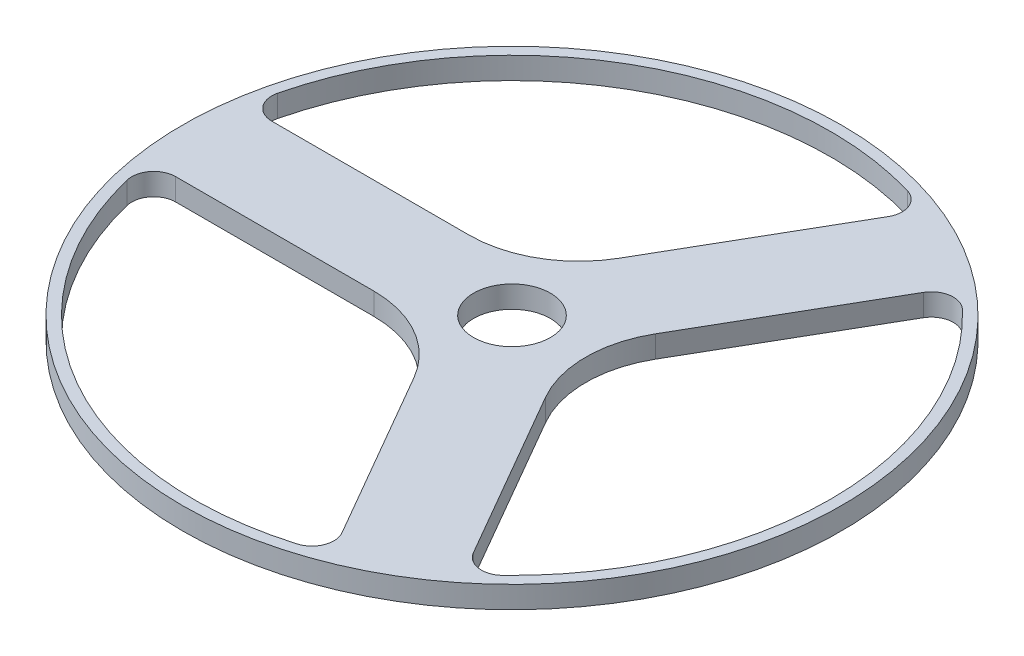
ISO-10303-21;
HEADER;
FILE_DESCRIPTION(('STEP AP214'),'2;1');
FILE_NAME('part.step','',(''),(''),'','','');
FILE_SCHEMA(('AUTOMOTIVE_DESIGN { 1 0 10303 214 1 1 1 1 }'));
ENDSEC;
DATA;
#1=APPLICATION_CONTEXT('core data for automotive mechanical design processes');
#2=APPLICATION_PROTOCOL_DEFINITION('international standard','automotive_design',2000,#1);
#3=PRODUCT_CONTEXT('',#1,'mechanical');
#4=PRODUCT('Part','Part','',(#3));
#5=PRODUCT_RELATED_PRODUCT_CATEGORY('part','',(#4));
#6=PRODUCT_DEFINITION_FORMATION('','',#4);
#7=PRODUCT_DEFINITION_CONTEXT('part definition',#1,'design');
#8=PRODUCT_DEFINITION('design','',#6,#7);
#9=PRODUCT_DEFINITION_SHAPE('','',#8);
#10=(LENGTH_UNIT() NAMED_UNIT(*) SI_UNIT(.MILLI.,.METRE.));
#11=(NAMED_UNIT(*) PLANE_ANGLE_UNIT() SI_UNIT($,.RADIAN.));
#12=(NAMED_UNIT(*) SI_UNIT($,.STERADIAN.) SOLID_ANGLE_UNIT());
#13=UNCERTAINTY_MEASURE_WITH_UNIT(LENGTH_MEASURE(1.E-05),#10,'distance_accuracy_value','');
#14=(GEOMETRIC_REPRESENTATION_CONTEXT(3) GLOBAL_UNCERTAINTY_ASSIGNED_CONTEXT((#13)) GLOBAL_UNIT_ASSIGNED_CONTEXT((#10,
#11,#12)) REPRESENTATION_CONTEXT('',''));
#15=CARTESIAN_POINT('',(0.,0.,0.));
#16=DIRECTION('',(0.,0.,1.));
#17=DIRECTION('',(1.,0.,0.));
#18=AXIS2_PLACEMENT_3D('',#15,#16,#17);
#19=CARTESIAN_POINT('',(-8.28821813545165,104.,-14.3733218856631));
#20=DIRECTION('',(0.,-1.,0.));
#21=DIRECTION('',(0.,0.,-1.));
#22=AXIS2_PLACEMENT_3D('',#19,#20,#21);
#23=CYLINDRICAL_SURFACE('',#22,10.);
#24=CARTESIAN_POINT('',(-8.28821813545165,102.,-14.3733218856631));
#25=DIRECTION('',(0.,1.,0.));
#26=DIRECTION('',(0.,0.,1.));
#27=AXIS2_PLACEMENT_3D('',#24,#25,#26);
#28=CIRCLE('',#27,10.);
#29=CARTESIAN_POINT('',(-8.28821813545166,102.,-4.37332188566308));
#30=VERTEX_POINT('',#29);
#31=CARTESIAN_POINT('',(0.372035902392733,102.,-9.37332188566309));
#32=VERTEX_POINT('',#31);
#33=EDGE_CURVE('E290',#30,#32,#28,.T.);
#34=ORIENTED_EDGE('',*,*,#33,.F.);
#35=DIRECTION('',(0.,-1.,0.));
#36=VECTOR('',#35,1.);
#37=CARTESIAN_POINT('',(-8.28821813545166,104.,-4.37332188566308));
#38=LINE('',#37,#36);
#39=CARTESIAN_POINT('',(-8.28821813545166,104.,-4.37332188566308));
#40=VERTEX_POINT('',#39);
#41=EDGE_CURVE('E306',#40,#30,#38,.T.);
#42=ORIENTED_EDGE('',*,*,#41,.F.);
#43=CARTESIAN_POINT('',(-8.28821813545165,104.,-14.3733218856631));
#44=DIRECTION('',(0.,1.,0.));
#45=DIRECTION('',(0.,0.,1.));
#46=AXIS2_PLACEMENT_3D('',#43,#44,#45);
#47=CIRCLE('',#46,10.);
#48=CARTESIAN_POINT('',(0.372035902392733,104.,-9.37332188566309));
#49=VERTEX_POINT('',#48);
#50=EDGE_CURVE('E252',#40,#49,#47,.T.);
#51=ORIENTED_EDGE('',*,*,#50,.T.);
#52=DIRECTION('',(0.,-1.,0.));
#53=VECTOR('',#52,1.);
#54=CARTESIAN_POINT('',(0.372035902392733,104.,-9.37332188566309));
#55=LINE('',#54,#53);
#56=EDGE_CURVE('E304',#49,#32,#55,.T.);
#57=ORIENTED_EDGE('',*,*,#56,.T.);
#58=EDGE_LOOP('',(#34,#42,#51,#57));
#59=FACE_BOUND('',#58,.T.);
#60=ADVANCED_FACE('F39',(#59),#23,.F.);
#61=CARTESIAN_POINT('',(0.,104.,-4.37332188566308));
#62=DIRECTION('',(0.,0.,1.));
#63=DIRECTION('',(1.,0.,0.));
#64=AXIS2_PLACEMENT_3D('',#61,#62,#63);
#65=PLANE('',#64);
#66=DIRECTION('',(-1.,0.,0.));
#67=VECTOR('',#66,1.);
#68=CARTESIAN_POINT('',(0.,102.,-4.37332188566308));
#69=LINE('',#68,#67);
#70=CARTESIAN_POINT('',(-26.2370114178755,102.,-4.37332188566309));
#71=VERTEX_POINT('',#70);
#72=EDGE_CURVE('E293',#30,#71,#69,.T.);
#73=ORIENTED_EDGE('',*,*,#72,.T.);
#74=DIRECTION('',(0.,-1.,0.));
#75=VECTOR('',#74,1.);
#76=CARTESIAN_POINT('',(-26.2370114178755,104.,-4.37332188566309));
#77=LINE('',#76,#75);
#78=CARTESIAN_POINT('',(-26.2370114178755,104.,-4.37332188566309));
#79=VERTEX_POINT('',#78);
#80=EDGE_CURVE('E335',#71,#79,#77,.F.);
#81=ORIENTED_EDGE('',*,*,#80,.T.);
#82=DIRECTION('',(-1.,0.,0.));
#83=VECTOR('',#82,1.);
#84=CARTESIAN_POINT('',(0.,104.,-4.37332188566308));
#85=LINE('',#84,#83);
#86=EDGE_CURVE('E255',#40,#79,#85,.T.);
#87=ORIENTED_EDGE('',*,*,#86,.F.);
#88=ORIENTED_EDGE('',*,*,#41,.T.);
#89=EDGE_LOOP('',(#73,#81,#87,#88));
#90=FACE_BOUND('',#89,.T.);
#91=ADVANCED_FACE('F407',(#90),#65,.F.);
#92=CARTESIAN_POINT('',(0.,104.,0.));
#93=DIRECTION('',(0.,-1.,0.));
#94=DIRECTION('',(0.,0.,-1.));
#95=AXIS2_PLACEMENT_3D('',#92,#93,#94);
#96=CYLINDRICAL_SURFACE('',#95,29.);
#97=CARTESIAN_POINT('',(0.,102.,0.));
#98=DIRECTION('',(0.,1.,0.));
#99=DIRECTION('',(0.,0.,1.));
#100=AXIS2_PLACEMENT_3D('',#97,#98,#99);
#101=CIRCLE('',#100,29.);
#102=CARTESIAN_POINT('',(8.1713288367965,102.,-27.8249777186063));
#103=VERTEX_POINT('',#102);
#104=CARTESIAN_POINT('',(-28.1804937451255,102.,-6.84541980311961));
#105=VERTEX_POINT('',#104);
#106=EDGE_CURVE('E273',#103,#105,#101,.T.);
#107=ORIENTED_EDGE('',*,*,#106,.F.);
#108=DIRECTION('',(0.,-1.,0.));
#109=VECTOR('',#108,1.);
#110=CARTESIAN_POINT('',(8.1713288367965,104.,-27.8249777186063));
#111=LINE('',#110,#109);
#112=CARTESIAN_POINT('',(8.1713288367965,104.,-27.8249777186063));
#113=VERTEX_POINT('',#112);
#114=EDGE_CURVE('E333',#103,#113,#111,.F.);
#115=ORIENTED_EDGE('',*,*,#114,.T.);
#116=CARTESIAN_POINT('',(0.,104.,0.));
#117=DIRECTION('',(0.,1.,0.));
#118=DIRECTION('',(0.,0.,1.));
#119=AXIS2_PLACEMENT_3D('',#116,#117,#118);
#120=CIRCLE('',#119,29.);
#121=CARTESIAN_POINT('',(-28.1804937451255,104.,-6.84541980311961));
#122=VERTEX_POINT('',#121);
#123=EDGE_CURVE('E235',#113,#122,#120,.T.);
#124=ORIENTED_EDGE('',*,*,#123,.T.);
#125=DIRECTION('',(0.,-1.,0.));
#126=VECTOR('',#125,1.);
#127=CARTESIAN_POINT('',(-28.1804937451255,104.,-6.84541980311961));
#128=LINE('',#127,#126);
#129=EDGE_CURVE('E330',#122,#105,#128,.T.);
#130=ORIENTED_EDGE('',*,*,#129,.T.);
#131=EDGE_LOOP('',(#107,#115,#124,#130));
#132=FACE_BOUND('',#131,.T.);
#133=ADVANCED_FACE('F413',(#132),#96,.F.);
#134=CARTESIAN_POINT('',(20.0802037298189,102.,20.9233223501663));
#135=VERTEX_POINT('',#134);
#136=CARTESIAN_POINT('',(20.0256337985227,102.,-20.9755569882534));
#137=VERTEX_POINT('',#136);
#138=EDGE_CURVE('E274',#135,#137,#101,.T.);
#139=ORIENTED_EDGE('',*,*,#138,.F.);
#140=DIRECTION('',(0.,-1.,0.));
#141=VECTOR('',#140,1.);
#142=CARTESIAN_POINT('',(20.0802037298189,104.,20.9233223501663));
#143=LINE('',#142,#141);
#144=CARTESIAN_POINT('',(20.0802037298189,104.,20.9233223501663));
#145=VERTEX_POINT('',#144);
#146=EDGE_CURVE('E323',#135,#145,#143,.F.);
#147=ORIENTED_EDGE('',*,*,#146,.T.);
#148=CARTESIAN_POINT('',(20.0256337985227,104.,-20.9755569882534));
#149=VERTEX_POINT('',#148);
#150=EDGE_CURVE('E236',#145,#149,#120,.T.);
#151=ORIENTED_EDGE('',*,*,#150,.T.);
#152=DIRECTION('',(0.,-1.,0.));
#153=VECTOR('',#152,1.);
#154=CARTESIAN_POINT('',(20.0256337985227,104.,-20.9755569882534));
#155=LINE('',#154,#153);
#156=EDGE_CURVE('E320',#149,#137,#155,.T.);
#157=ORIENTED_EDGE('',*,*,#156,.T.);
#158=EDGE_LOOP('',(#139,#147,#151,#157));
#159=FACE_BOUND('',#158,.T.);
#160=ADVANCED_FACE('F429',(#159),#96,.F.);
#161=CARTESIAN_POINT('',(3.8542384426668,104.,-2.22524560239468));
#162=DIRECTION('',(0.866025403784438,0.,-0.5));
#163=DIRECTION('',(-0.5,0.,-0.866025403784439));
#164=AXIS2_PLACEMENT_3D('',#161,#162,#163);
#165=PLANE('',#164);
#166=DIRECTION('',(0.5,0.,0.866025403784439));
#167=VECTOR('',#166,1.);
#168=CARTESIAN_POINT('',(3.8542384426668,104.,-2.22524560239468));
#169=LINE('',#168,#167);
#170=CARTESIAN_POINT('',(7.98629377119233,104.,4.93168416629725));
#171=VERTEX_POINT('',#170);
#172=CARTESIAN_POINT('',(16.9633112857108,104.,20.4803346018789));
#173=VERTEX_POINT('',#172);
#174=EDGE_CURVE('E243',#171,#173,#169,.T.);
#175=ORIENTED_EDGE('',*,*,#174,.T.);
#176=DIRECTION('',(0.,1.,0.));
#177=VECTOR('',#176,1.);
#178=CARTESIAN_POINT('',(16.9633112857108,102.,20.4803346018789));
#179=LINE('',#178,#177);
#180=CARTESIAN_POINT('',(16.9633112857108,102.,20.4803346018789));
#181=VERTEX_POINT('',#180);
#182=EDGE_CURVE('E309',#173,#181,#179,.F.);
#183=ORIENTED_EDGE('',*,*,#182,.T.);
#184=DIRECTION('',(0.5,0.,0.866025403784439));
#185=VECTOR('',#184,1.);
#186=CARTESIAN_POINT('',(3.8542384426668,102.,-2.22524560239468));
#187=LINE('',#186,#185);
#188=CARTESIAN_POINT('',(7.98629377119233,102.,4.93168416629725));
#189=VERTEX_POINT('',#188);
#190=EDGE_CURVE('E281',#189,#181,#187,.T.);
#191=ORIENTED_EDGE('',*,*,#190,.F.);
#192=DIRECTION('',(0.,-1.,0.));
#193=VECTOR('',#192,1.);
#194=CARTESIAN_POINT('',(7.98629377119233,104.,4.93168416629725));
#195=LINE('',#194,#193);
#196=EDGE_CURVE('E307',#171,#189,#195,.T.);
#197=ORIENTED_EDGE('',*,*,#196,.F.);
#198=EDGE_LOOP('',(#175,#183,#191,#197));
#199=FACE_BOUND('',#198,.T.);
#200=ADVANCED_FACE('F426',(#199),#165,.T.);
#201=CARTESIAN_POINT('',(16.6465478090367,104.,-0.0683158337027538));
#202=DIRECTION('',(0.,-1.,0.));
#203=DIRECTION('',(0.,0.,-1.));
#204=AXIS2_PLACEMENT_3D('',#201,#202,#203);
#205=CYLINDRICAL_SURFACE('',#204,10.);
#206=CARTESIAN_POINT('',(16.6465478090367,102.,-0.0683158337027538));
#207=DIRECTION('',(0.,1.,0.));
#208=DIRECTION('',(0.,0.,1.));
#209=AXIS2_PLACEMENT_3D('',#206,#207,#208);
#210=CIRCLE('',#209,10.);
#211=CARTESIAN_POINT('',(7.98629377119233,102.,-5.06831583370275));
#212=VERTEX_POINT('',#211);
#213=EDGE_CURVE('E284',#189,#212,#210,.F.);
#214=ORIENTED_EDGE('',*,*,#213,.T.);
#215=DIRECTION('',(0.,-1.,0.));
#216=VECTOR('',#215,1.);
#217=CARTESIAN_POINT('',(7.98629377119233,104.,-5.06831583370275));
#218=LINE('',#217,#216);
#219=CARTESIAN_POINT('',(7.98629377119233,104.,-5.06831583370275));
#220=VERTEX_POINT('',#219);
#221=EDGE_CURVE('E310',#220,#212,#218,.T.);
#222=ORIENTED_EDGE('',*,*,#221,.F.);
#223=CARTESIAN_POINT('',(16.6465478090367,104.,-0.0683158337027538));
#224=DIRECTION('',(0.,1.,0.));
#225=DIRECTION('',(0.,0.,1.));
#226=AXIS2_PLACEMENT_3D('',#223,#224,#225);
#227=CIRCLE('',#226,10.);
#228=EDGE_CURVE('E246',#171,#220,#227,.F.);
#229=ORIENTED_EDGE('',*,*,#228,.F.);
#230=ORIENTED_EDGE('',*,*,#196,.T.);
#231=EDGE_LOOP('',(#214,#222,#229,#230));
#232=FACE_BOUND('',#231,.T.);
#233=ADVANCED_FACE('F423',(#232),#205,.F.);
#234=CARTESIAN_POINT('',(-28.1804937451255,102.,6.84541980311961));
#235=VERTEX_POINT('',#234);
#236=CARTESIAN_POINT('',(8.24372293905421,102.,27.8036154502272));
#237=VERTEX_POINT('',#236);
#238=EDGE_CURVE('E268',#235,#237,#101,.T.);
#239=ORIENTED_EDGE('',*,*,#238,.F.);
#240=DIRECTION('',(0.,-1.,0.));
#241=VECTOR('',#240,1.);
#242=CARTESIAN_POINT('',(-28.1804937451255,104.,6.84541980311962));
#243=LINE('',#242,#241);
#244=CARTESIAN_POINT('',(-28.1804937451255,104.,6.84541980311961));
#245=VERTEX_POINT('',#244);
#246=EDGE_CURVE('E343',#235,#245,#243,.F.);
#247=ORIENTED_EDGE('',*,*,#246,.T.);
#248=CARTESIAN_POINT('',(8.24372293905421,104.,27.8036154502272));
#249=VERTEX_POINT('',#248);
#250=EDGE_CURVE('E230',#245,#249,#120,.T.);
#251=ORIENTED_EDGE('',*,*,#250,.T.);
#252=DIRECTION('',(0.,-1.,0.));
#253=VECTOR('',#252,1.);
#254=CARTESIAN_POINT('',(8.24372293905421,104.,27.8036154502272));
#255=LINE('',#254,#253);
#256=EDGE_CURVE('E340',#249,#237,#255,.T.);
#257=ORIENTED_EDGE('',*,*,#256,.T.);
#258=EDGE_LOOP('',(#239,#247,#251,#257));
#259=FACE_BOUND('',#258,.T.);
#260=ADVANCED_FACE('F382',(#259),#96,.F.);
#261=CARTESIAN_POINT('',(0.,104.,4.37332188566309));
#262=DIRECTION('',(0.,0.,1.));
#263=DIRECTION('',(1.,0.,0.));
#264=AXIS2_PLACEMENT_3D('',#261,#262,#263);
#265=PLANE('',#264);
#266=DIRECTION('',(-1.,0.,0.));
#267=VECTOR('',#266,1.);
#268=CARTESIAN_POINT('',(0.,104.,4.37332188566309));
#269=LINE('',#268,#267);
#270=CARTESIAN_POINT('',(-8.20933380549526,104.,4.37332188566309));
#271=VERTEX_POINT('',#270);
#272=CARTESIAN_POINT('',(-26.2370114178755,104.,4.37332188566309));
#273=VERTEX_POINT('',#272);
#274=EDGE_CURVE('E233',#271,#273,#269,.T.);
#275=ORIENTED_EDGE('',*,*,#274,.T.);
#276=DIRECTION('',(0.,1.,0.));
#277=VECTOR('',#276,1.);
#278=CARTESIAN_POINT('',(-26.2370114178755,102.,4.37332188566309));
#279=LINE('',#278,#277);
#280=CARTESIAN_POINT('',(-26.2370114178755,102.,4.37332188566309));
#281=VERTEX_POINT('',#280);
#282=EDGE_CURVE('E337',#273,#281,#279,.F.);
#283=ORIENTED_EDGE('',*,*,#282,.T.);
#284=DIRECTION('',(-1.,0.,0.));
#285=VECTOR('',#284,1.);
#286=CARTESIAN_POINT('',(0.,102.,4.37332188566309));
#287=LINE('',#286,#285);
#288=CARTESIAN_POINT('',(-8.20933380549526,102.,4.37332188566309));
#289=VERTEX_POINT('',#288);
#290=EDGE_CURVE('E271',#289,#281,#287,.T.);
#291=ORIENTED_EDGE('',*,*,#290,.F.);
#292=DIRECTION('',(0.,-1.,0.));
#293=VECTOR('',#292,1.);
#294=CARTESIAN_POINT('',(-8.20933380549526,104.,4.37332188566309));
#295=LINE('',#294,#293);
#296=EDGE_CURVE('E313',#271,#289,#295,.T.);
#297=ORIENTED_EDGE('',*,*,#296,.F.);
#298=EDGE_LOOP('',(#275,#283,#291,#297));
#299=FACE_BOUND('',#298,.T.);
#300=ADVANCED_FACE('F389',(#299),#265,.T.);
#301=CARTESIAN_POINT('',(-8.20933380549526,104.,14.3733218856631));
#302=DIRECTION('',(0.,-1.,0.));
#303=DIRECTION('',(0.,0.,-1.));
#304=AXIS2_PLACEMENT_3D('',#301,#302,#303);
#305=CYLINDRICAL_SURFACE('',#304,10.);
#306=CARTESIAN_POINT('',(-8.20933380549526,102.,14.3733218856631));
#307=DIRECTION('',(0.,1.,0.));
#308=DIRECTION('',(0.,0.,1.));
#309=AXIS2_PLACEMENT_3D('',#306,#307,#308);
#310=CIRCLE('',#309,10.);
#311=CARTESIAN_POINT('',(0.450920232349128,102.,9.37332188566308));
#312=VERTEX_POINT('',#311);
#313=EDGE_CURVE('E277',#289,#312,#310,.F.);
#314=ORIENTED_EDGE('',*,*,#313,.T.);
#315=DIRECTION('',(0.,-1.,0.));
#316=VECTOR('',#315,1.);
#317=CARTESIAN_POINT('',(0.450920232349128,104.,9.37332188566308));
#318=LINE('',#317,#316);
#319=CARTESIAN_POINT('',(0.450920232349128,104.,9.37332188566308));
#320=VERTEX_POINT('',#319);
#321=EDGE_CURVE('E267',#320,#312,#318,.T.);
#322=ORIENTED_EDGE('',*,*,#321,.F.);
#323=CARTESIAN_POINT('',(-8.20933380549526,104.,14.3733218856631));
#324=DIRECTION('',(0.,1.,0.));
#325=DIRECTION('',(0.,0.,1.));
#326=AXIS2_PLACEMENT_3D('',#323,#324,#325);
#327=CIRCLE('',#326,10.);
#328=EDGE_CURVE('E239',#271,#320,#327,.F.);
#329=ORIENTED_EDGE('',*,*,#328,.F.);
#330=ORIENTED_EDGE('',*,*,#296,.T.);
#331=EDGE_LOOP('',(#314,#322,#329,#330));
#332=FACE_BOUND('',#331,.T.);
#333=ADVANCED_FACE('F393',(#332),#305,.F.);
#334=CARTESIAN_POINT('',(0.,104.,0.));
#335=DIRECTION('',(0.,-1.,0.));
#336=DIRECTION('',(0.,0.,-1.));
#337=AXIS2_PLACEMENT_3D('',#334,#335,#336);
#338=CYLINDRICAL_SURFACE('',#337,3.5);
#339=CARTESIAN_POINT('',(0.,104.,0.));
#340=DIRECTION('',(0.,1.,0.));
#341=DIRECTION('',(0.,0.,1.));
#342=AXIS2_PLACEMENT_3D('',#339,#340,#341);
#343=CIRCLE('',#342,3.5);
#344=CARTESIAN_POINT('',(0.,104.,3.5));
#345=VERTEX_POINT('',#344);
#346=EDGE_CURVE('E261',#345,#345,#343,.F.);
#347=ORIENTED_EDGE('',*,*,#346,.F.);
#348=EDGE_LOOP('',(#347));
#349=FACE_BOUND('',#348,.T.);
#350=CARTESIAN_POINT('',(0.,102.,0.));
#351=DIRECTION('',(0.,1.,0.));
#352=DIRECTION('',(0.,0.,1.));
#353=AXIS2_PLACEMENT_3D('',#350,#351,#352);
#354=CIRCLE('',#353,3.5);
#355=CARTESIAN_POINT('',(0.,102.,3.5));
#356=VERTEX_POINT('',#355);
#357=EDGE_CURVE('E299',#356,#356,#354,.F.);
#358=ORIENTED_EDGE('',*,*,#357,.T.);
#359=EDGE_LOOP('',(#358));
#360=FACE_BOUND('',#359,.T.);
#361=ADVANCED_FACE('F395',(#349,#360),#338,.F.);
#362=CARTESIAN_POINT('',(-3.77974050862189,104.,-2.18223420011978));
#363=DIRECTION('',(-0.866025403784439,0.,-0.499999999999999));
#364=DIRECTION('',(-0.499999999999999,0.,0.866025403784439));
#365=AXIS2_PLACEMENT_3D('',#362,#363,#364);
#366=PLANE('',#365);
#367=DIRECTION('',(0.499999999999999,0.,-0.866025403784439));
#368=VECTOR('',#367,1.);
#369=CARTESIAN_POINT('',(-3.77974050862189,104.,-2.18223420011978));
#370=LINE('',#369,#368);
#371=CARTESIAN_POINT('',(9.33983972458632,104.,-24.9060137380128));
#372=VERTEX_POINT('',#371);
#373=EDGE_CURVE('E258',#49,#372,#370,.T.);
#374=ORIENTED_EDGE('',*,*,#373,.T.);
#375=DIRECTION('',(0.,1.,0.));
#376=VECTOR('',#375,1.);
#377=CARTESIAN_POINT('',(9.33983972458631,102.,-24.9060137380128));
#378=LINE('',#377,#376);
#379=CARTESIAN_POINT('',(9.33983972458632,102.,-24.9060137380128));
#380=VERTEX_POINT('',#379);
#381=EDGE_CURVE('E327',#372,#380,#378,.F.);
#382=ORIENTED_EDGE('',*,*,#381,.T.);
#383=DIRECTION('',(0.499999999999999,0.,-0.866025403784439));
#384=VECTOR('',#383,1.);
#385=CARTESIAN_POINT('',(-3.77974050862189,102.,-2.18223420011978));
#386=LINE('',#385,#384);
#387=EDGE_CURVE('E296',#32,#380,#386,.T.);
#388=ORIENTED_EDGE('',*,*,#387,.F.);
#389=ORIENTED_EDGE('',*,*,#56,.F.);
#390=EDGE_LOOP('',(#374,#382,#388,#389));
#391=FACE_BOUND('',#390,.T.);
#392=ADVANCED_FACE('F401',(#391),#366,.T.);
#393=CARTESIAN_POINT('',(3.79507519519951,104.,2.19108768554331));
#394=DIRECTION('',(-0.866025403784439,0.,-0.499999999999999));
#395=DIRECTION('',(-0.499999999999999,0.,0.866025403784439));
#396=AXIS2_PLACEMENT_3D('',#393,#394,#395);
#397=PLANE('',#396);
#398=DIRECTION('',(0.499999999999999,0.,-0.866025403784439));
#399=VECTOR('',#398,1.);
#400=CARTESIAN_POINT('',(3.79507519519951,102.,2.19108768554331));
#401=LINE('',#400,#399);
#402=CARTESIAN_POINT('',(16.9125047979522,102.,-20.5289668511325));
#403=VERTEX_POINT('',#402);
#404=EDGE_CURVE('E287',#212,#403,#401,.T.);
#405=ORIENTED_EDGE('',*,*,#404,.T.);
#406=DIRECTION('',(0.,-1.,0.));
#407=VECTOR('',#406,1.);
#408=CARTESIAN_POINT('',(16.9125047979522,104.,-20.5289668511325));
#409=LINE('',#408,#407);
#410=CARTESIAN_POINT('',(16.9125047979522,104.,-20.5289668511325));
#411=VERTEX_POINT('',#410);
#412=EDGE_CURVE('E325',#403,#411,#409,.F.);
#413=ORIENTED_EDGE('',*,*,#412,.T.);
#414=DIRECTION('',(0.499999999999999,0.,-0.866025403784439));
#415=VECTOR('',#414,1.);
#416=CARTESIAN_POINT('',(3.79507519519951,104.,2.19108768554331));
#417=LINE('',#416,#415);
#418=EDGE_CURVE('E249',#220,#411,#417,.T.);
#419=ORIENTED_EDGE('',*,*,#418,.F.);
#420=ORIENTED_EDGE('',*,*,#221,.T.);
#421=EDGE_LOOP('',(#405,#413,#419,#420));
#422=FACE_BOUND('',#421,.T.);
#423=ADVANCED_FACE('F419',(#422),#397,.F.);
#424=CARTESIAN_POINT('',(-3.7205772611546,104.,2.14807628326841));
#425=DIRECTION('',(0.866025403784439,0.,-0.5));
#426=DIRECTION('',(-0.5,0.,-0.866025403784439));
#427=AXIS2_PLACEMENT_3D('',#424,#425,#426);
#428=PLANE('',#427);
#429=DIRECTION('',(0.5,0.,0.866025403784439));
#430=VECTOR('',#429,1.);
#431=CARTESIAN_POINT('',(-3.7205772611546,102.,2.14807628326841));
#432=LINE('',#431,#430);
#433=CARTESIAN_POINT('',(9.40724113013659,102.,24.8861247295219));
#434=VERTEX_POINT('',#433);
#435=EDGE_CURVE('E279',#312,#434,#432,.T.);
#436=ORIENTED_EDGE('',*,*,#435,.T.);
#437=DIRECTION('',(0.,-1.,0.));
#438=VECTOR('',#437,1.);
#439=CARTESIAN_POINT('',(9.40724113013659,104.,24.8861247295219));
#440=LINE('',#439,#438);
#441=CARTESIAN_POINT('',(9.40724113013659,104.,24.8861247295219));
#442=VERTEX_POINT('',#441);
#443=EDGE_CURVE('E62',#434,#442,#440,.F.);
#444=ORIENTED_EDGE('',*,*,#443,.T.);
#445=DIRECTION('',(0.5,0.,0.866025403784439));
#446=VECTOR('',#445,1.);
#447=CARTESIAN_POINT('',(-3.7205772611546,104.,2.14807628326841));
#448=LINE('',#447,#446);
#449=EDGE_CURVE('E241',#320,#442,#448,.T.);
#450=ORIENTED_EDGE('',*,*,#449,.F.);
#451=ORIENTED_EDGE('',*,*,#321,.T.);
#452=EDGE_LOOP('',(#436,#444,#450,#451));
#453=FACE_BOUND('',#452,.T.);
#454=ADVANCED_FACE('F373',(#453),#428,.F.);
#455=CARTESIAN_POINT('',(0.,104.,0.));
#456=DIRECTION('',(0.,-1.,0.));
#457=DIRECTION('',(0.,0.,-1.));
#458=AXIS2_PLACEMENT_3D('',#455,#456,#457);
#459=CYLINDRICAL_SURFACE('',#458,30.);
#460=CARTESIAN_POINT('',(0.,104.,0.));
#461=DIRECTION('',(0.,1.,0.));
#462=DIRECTION('',(0.,0.,1.));
#463=AXIS2_PLACEMENT_3D('',#460,#461,#462);
#464=CIRCLE('',#463,30.);
#465=CARTESIAN_POINT('',(0.,104.,30.));
#466=VERTEX_POINT('',#465);
#467=EDGE_CURVE('E264',#466,#466,#464,.T.);
#468=ORIENTED_EDGE('',*,*,#467,.F.);
#469=EDGE_LOOP('',(#468));
#470=FACE_BOUND('',#469,.T.);
#471=CARTESIAN_POINT('',(0.,102.,0.));
#472=DIRECTION('',(0.,1.,0.));
#473=DIRECTION('',(0.,0.,1.));
#474=AXIS2_PLACEMENT_3D('',#471,#472,#473);
#475=CIRCLE('',#474,30.);
#476=CARTESIAN_POINT('',(0.,102.,30.));
#477=VERTEX_POINT('',#476);
#478=EDGE_CURVE('E234',#477,#477,#475,.T.);
#479=ORIENTED_EDGE('',*,*,#478,.T.);
#480=EDGE_LOOP('',(#479));
#481=FACE_BOUND('',#480,.T.);
#482=ADVANCED_FACE('F432',(#470,#481),#459,.T.);
#483=CARTESIAN_POINT('',(0.,104.,0.));
#484=DIRECTION('',(0.,1.,0.));
#485=DIRECTION('',(0.,0.,1.));
#486=AXIS2_PLACEMENT_3D('',#483,#484,#485);
#487=PLANE('',#486);
#488=ORIENTED_EDGE('',*,*,#250,.F.);
#489=CARTESIAN_POINT('',(-26.2370114178755,104.,6.37332188566309));
#490=DIRECTION('',(0.,1.,0.));
#491=DIRECTION('',(0.,0.,1.));
#492=AXIS2_PLACEMENT_3D('',#489,#490,#491);
#493=CIRCLE('',#492,2.);
#494=EDGE_CURVE('E364',#245,#273,#493,.F.);
#495=ORIENTED_EDGE('',*,*,#494,.T.);
#496=ORIENTED_EDGE('',*,*,#274,.F.);
#497=ORIENTED_EDGE('',*,*,#328,.T.);
#498=ORIENTED_EDGE('',*,*,#449,.T.);
#499=CARTESIAN_POINT('',(7.67519032256771,104.,25.8861247295219));
#500=DIRECTION('',(0.,1.,0.));
#501=DIRECTION('',(0.,0.,1.));
#502=AXIS2_PLACEMENT_3D('',#499,#500,#501);
#503=CIRCLE('',#502,2.);
#504=EDGE_CURVE('E11',#442,#249,#503,.F.);
#505=ORIENTED_EDGE('',*,*,#504,.T.);
#506=EDGE_LOOP('',(#488,#495,#496,#497,#498,#505));
#507=FACE_BOUND('',#506,.T.);
#508=ORIENTED_EDGE('',*,*,#150,.F.);
#509=CARTESIAN_POINT('',(18.6953620932797,104.,19.4803346018789));
#510=DIRECTION('',(0.,1.,0.));
#511=DIRECTION('',(0.,0.,1.));
#512=AXIS2_PLACEMENT_3D('',#509,#510,#511);
#513=CIRCLE('',#512,2.);
#514=EDGE_CURVE('E348',#145,#173,#513,.F.);
#515=ORIENTED_EDGE('',*,*,#514,.T.);
#516=ORIENTED_EDGE('',*,*,#174,.F.);
#517=ORIENTED_EDGE('',*,*,#228,.T.);
#518=ORIENTED_EDGE('',*,*,#418,.T.);
#519=CARTESIAN_POINT('',(18.6445556055211,104.,-19.5289668511325));
#520=DIRECTION('',(0.,1.,0.));
#521=DIRECTION('',(0.,0.,1.));
#522=AXIS2_PLACEMENT_3D('',#519,#520,#521);
#523=CIRCLE('',#522,2.);
#524=EDGE_CURVE('E352',#411,#149,#523,.F.);
#525=ORIENTED_EDGE('',*,*,#524,.T.);
#526=EDGE_LOOP('',(#508,#515,#516,#517,#518,#525));
#527=FACE_BOUND('',#526,.T.);
#528=ORIENTED_EDGE('',*,*,#50,.F.);
#529=ORIENTED_EDGE('',*,*,#86,.T.);
#530=CARTESIAN_POINT('',(-26.2370114178755,104.,-6.37332188566309));
#531=DIRECTION('',(0.,1.,0.));
#532=DIRECTION('',(0.,0.,1.));
#533=AXIS2_PLACEMENT_3D('',#530,#531,#532);
#534=CIRCLE('',#533,2.);
#535=EDGE_CURVE('E360',#79,#122,#534,.F.);
#536=ORIENTED_EDGE('',*,*,#535,.T.);
#537=ORIENTED_EDGE('',*,*,#123,.F.);
#538=CARTESIAN_POINT('',(7.60778891701743,104.,-25.9060137380128));
#539=DIRECTION('',(0.,1.,0.));
#540=DIRECTION('',(0.,0.,1.));
#541=AXIS2_PLACEMENT_3D('',#538,#539,#540);
#542=CIRCLE('',#541,2.);
#543=EDGE_CURVE('E356',#113,#372,#542,.F.);
#544=ORIENTED_EDGE('',*,*,#543,.T.);
#545=ORIENTED_EDGE('',*,*,#373,.F.);
#546=EDGE_LOOP('',(#528,#529,#536,#537,#544,#545));
#547=FACE_BOUND('',#546,.T.);
#548=ORIENTED_EDGE('',*,*,#346,.T.);
#549=EDGE_LOOP('',(#548));
#550=FACE_BOUND('',#549,.T.);
#551=ORIENTED_EDGE('',*,*,#467,.T.);
#552=EDGE_LOOP('',(#551));
#553=FACE_BOUND('',#552,.T.);
#554=ADVANCED_FACE('F378',(#507,#527,#547,#550,#553),#487,.T.);
#555=CARTESIAN_POINT('',(0.,102.,0.));
#556=DIRECTION('',(0.,1.,0.));
#557=DIRECTION('',(0.,0.,1.));
#558=AXIS2_PLACEMENT_3D('',#555,#556,#557);
#559=PLANE('',#558);
#560=CARTESIAN_POINT('',(-15.,102.,0.));
#561=DIRECTION('',(0.,-1.,0.));
#562=DIRECTION('',(0.,0.,-1.));
#563=AXIS2_PLACEMENT_3D('',#560,#561,#562);
#564=CIRCLE('',#563,1.);
#565=CARTESIAN_POINT('',(-15.,102.,-1.));
#566=VERTEX_POINT('',#565);
#567=EDGE_CURVE('E645',#566,#566,#564,.T.);
#568=ORIENTED_EDGE('',*,*,#567,.F.);
#569=EDGE_LOOP('',(#568));
#570=FACE_BOUND('',#569,.T.);
#571=CARTESIAN_POINT('',(7.5,102.,12.9903810567666));
#572=DIRECTION('',(0.,-1.,0.));
#573=DIRECTION('',(0.,0.,-1.));
#574=AXIS2_PLACEMENT_3D('',#571,#572,#573);
#575=CIRCLE('',#574,3.5);
#576=CARTESIAN_POINT('',(7.5,102.,9.49038105676658));
#577=VERTEX_POINT('',#576);
#578=EDGE_CURVE('E215',#577,#577,#575,.T.);
#579=ORIENTED_EDGE('',*,*,#578,.F.);
#580=EDGE_LOOP('',(#579));
#581=FACE_BOUND('',#580,.T.);
#582=DIRECTION('',(0.5,0.,-0.866025403784439));
#583=VECTOR('',#582,1.);
#584=CARTESIAN_POINT('',(8.38397459621556,102.,-16.5214699700121));
#585=LINE('',#584,#583);
#586=CARTESIAN_POINT('',(4.88397459621555,102.,-10.459292143521));
#587=VERTEX_POINT('',#586);
#588=CARTESIAN_POINT('',(8.38397459621556,102.,-16.5214699700121));
#589=VERTEX_POINT('',#588);
#590=EDGE_CURVE('E221',#587,#589,#585,.T.);
#591=ORIENTED_EDGE('',*,*,#590,.F.);
#592=DIRECTION('',(-0.86602540378444,0.,-0.499999999999997));
#593=VECTOR('',#592,1.);
#594=CARTESIAN_POINT('',(4.88397459621555,102.,-10.459292143521));
#595=LINE('',#594,#593);
#596=CARTESIAN_POINT('',(6.61602540378444,102.,-9.45929214352104));
#597=VERTEX_POINT('',#596);
#598=EDGE_CURVE('E54',#597,#587,#595,.T.);
#599=ORIENTED_EDGE('',*,*,#598,.F.);
#600=DIRECTION('',(-0.499999999999999,0.,0.866025403784439));
#601=VECTOR('',#600,1.);
#602=CARTESIAN_POINT('',(10.1160254037844,102.,-15.5214699700121));
#603=LINE('',#602,#601);
#604=CARTESIAN_POINT('',(10.1160254037844,102.,-15.5214699700121));
#605=VERTEX_POINT('',#604);
#606=EDGE_CURVE('E209',#605,#597,#603,.T.);
#607=ORIENTED_EDGE('',*,*,#606,.F.);
#608=DIRECTION('',(0.866025403784439,0.,0.499999999999999));
#609=VECTOR('',#608,1.);
#610=CARTESIAN_POINT('',(8.38397459621556,102.,-16.5214699700121));
#611=LINE('',#610,#609);
#612=EDGE_CURVE('E212',#589,#605,#611,.T.);
#613=ORIENTED_EDGE('',*,*,#612,.F.);
#614=EDGE_LOOP('',(#591,#599,#607,#613));
#615=FACE_BOUND('',#614,.T.);
#616=ORIENTED_EDGE('',*,*,#290,.T.);
#617=CARTESIAN_POINT('',(-26.2370114178755,102.,6.37332188566309));
#618=DIRECTION('',(0.,1.,0.));
#619=DIRECTION('',(0.,0.,1.));
#620=AXIS2_PLACEMENT_3D('',#617,#618,#619);
#621=CIRCLE('',#620,2.);
#622=EDGE_CURVE('E362',#281,#235,#621,.T.);
#623=ORIENTED_EDGE('',*,*,#622,.T.);
#624=ORIENTED_EDGE('',*,*,#238,.T.);
#625=CARTESIAN_POINT('',(7.67519032256771,102.,25.8861247295219));
#626=DIRECTION('',(0.,1.,0.));
#627=DIRECTION('',(0.,0.,1.));
#628=AXIS2_PLACEMENT_3D('',#625,#626,#627);
#629=CIRCLE('',#628,2.);
#630=EDGE_CURVE('E47',#237,#434,#629,.T.);
#631=ORIENTED_EDGE('',*,*,#630,.T.);
#632=ORIENTED_EDGE('',*,*,#435,.F.);
#633=ORIENTED_EDGE('',*,*,#313,.F.);
#634=EDGE_LOOP('',(#616,#623,#624,#631,#632,#633));
#635=FACE_BOUND('',#634,.T.);
#636=ORIENTED_EDGE('',*,*,#190,.T.);
#637=CARTESIAN_POINT('',(18.6953620932797,102.,19.4803346018789));
#638=DIRECTION('',(0.,1.,0.));
#639=DIRECTION('',(0.,0.,1.));
#640=AXIS2_PLACEMENT_3D('',#637,#638,#639);
#641=CIRCLE('',#640,2.);
#642=EDGE_CURVE('E346',#181,#135,#641,.T.);
#643=ORIENTED_EDGE('',*,*,#642,.T.);
#644=ORIENTED_EDGE('',*,*,#138,.T.);
#645=CARTESIAN_POINT('',(18.6445556055211,102.,-19.5289668511325));
#646=DIRECTION('',(0.,1.,0.));
#647=DIRECTION('',(0.,0.,1.));
#648=AXIS2_PLACEMENT_3D('',#645,#646,#647);
#649=CIRCLE('',#648,2.);
#650=EDGE_CURVE('E350',#137,#403,#649,.T.);
#651=ORIENTED_EDGE('',*,*,#650,.T.);
#652=ORIENTED_EDGE('',*,*,#404,.F.);
#653=ORIENTED_EDGE('',*,*,#213,.F.);
#654=EDGE_LOOP('',(#636,#643,#644,#651,#652,#653));
#655=FACE_BOUND('',#654,.T.);
#656=ORIENTED_EDGE('',*,*,#33,.T.);
#657=ORIENTED_EDGE('',*,*,#387,.T.);
#658=CARTESIAN_POINT('',(7.60778891701743,102.,-25.9060137380128));
#659=DIRECTION('',(0.,1.,0.));
#660=DIRECTION('',(0.,0.,1.));
#661=AXIS2_PLACEMENT_3D('',#658,#659,#660);
#662=CIRCLE('',#661,2.);
#663=EDGE_CURVE('E354',#380,#103,#662,.T.);
#664=ORIENTED_EDGE('',*,*,#663,.T.);
#665=ORIENTED_EDGE('',*,*,#106,.T.);
#666=CARTESIAN_POINT('',(-26.2370114178755,102.,-6.37332188566309));
#667=DIRECTION('',(0.,1.,0.));
#668=DIRECTION('',(0.,0.,1.));
#669=AXIS2_PLACEMENT_3D('',#666,#667,#668);
#670=CIRCLE('',#669,2.);
#671=EDGE_CURVE('E358',#105,#71,#670,.T.);
#672=ORIENTED_EDGE('',*,*,#671,.T.);
#673=ORIENTED_EDGE('',*,*,#72,.F.);
#674=EDGE_LOOP('',(#656,#657,#664,#665,#672,#673));
#675=FACE_BOUND('',#674,.T.);
#676=ORIENTED_EDGE('',*,*,#357,.F.);
#677=EDGE_LOOP('',(#676));
#678=FACE_BOUND('',#677,.T.);
#679=ORIENTED_EDGE('',*,*,#478,.F.);
#680=EDGE_LOOP('',(#679));
#681=FACE_BOUND('',#680,.T.);
#682=ADVANCED_FACE('F367',(#570,#581,#615,#635,#655,#675,#678,#681),#559,.F.);
#683=CARTESIAN_POINT('',(18.6953620932797,104.,19.4803346018789));
#684=DIRECTION('',(0.,-1.,0.));
#685=DIRECTION('',(0.,0.,-1.));
#686=AXIS2_PLACEMENT_3D('',#683,#684,#685);
#687=CYLINDRICAL_SURFACE('',#686,2.);
#688=ORIENTED_EDGE('',*,*,#514,.F.);
#689=ORIENTED_EDGE('',*,*,#146,.F.);
#690=ORIENTED_EDGE('',*,*,#642,.F.);
#691=ORIENTED_EDGE('',*,*,#182,.F.);
#692=EDGE_LOOP('',(#688,#689,#690,#691));
#693=FACE_BOUND('',#692,.T.);
#694=ADVANCED_FACE('F498',(#693),#687,.F.);
#695=CARTESIAN_POINT('',(18.6445556055211,104.,-19.5289668511325));
#696=DIRECTION('',(0.,-1.,0.));
#697=DIRECTION('',(0.,0.,-1.));
#698=AXIS2_PLACEMENT_3D('',#695,#696,#697);
#699=CYLINDRICAL_SURFACE('',#698,2.);
#700=ORIENTED_EDGE('',*,*,#524,.F.);
#701=ORIENTED_EDGE('',*,*,#412,.F.);
#702=ORIENTED_EDGE('',*,*,#650,.F.);
#703=ORIENTED_EDGE('',*,*,#156,.F.);
#704=EDGE_LOOP('',(#700,#701,#702,#703));
#705=FACE_BOUND('',#704,.T.);
#706=ADVANCED_FACE('F503',(#705),#699,.F.);
#707=CARTESIAN_POINT('',(7.60778891701743,104.,-25.9060137380128));
#708=DIRECTION('',(0.,-1.,0.));
#709=DIRECTION('',(0.,0.,-1.));
#710=AXIS2_PLACEMENT_3D('',#707,#708,#709);
#711=CYLINDRICAL_SURFACE('',#710,2.);
#712=ORIENTED_EDGE('',*,*,#543,.F.);
#713=ORIENTED_EDGE('',*,*,#114,.F.);
#714=ORIENTED_EDGE('',*,*,#663,.F.);
#715=ORIENTED_EDGE('',*,*,#381,.F.);
#716=EDGE_LOOP('',(#712,#713,#714,#715));
#717=FACE_BOUND('',#716,.T.);
#718=ADVANCED_FACE('F514',(#717),#711,.F.);
#719=CARTESIAN_POINT('',(-26.2370114178755,104.,-6.37332188566309));
#720=DIRECTION('',(0.,-1.,0.));
#721=DIRECTION('',(0.,0.,-1.));
#722=AXIS2_PLACEMENT_3D('',#719,#720,#721);
#723=CYLINDRICAL_SURFACE('',#722,2.);
#724=ORIENTED_EDGE('',*,*,#535,.F.);
#725=ORIENTED_EDGE('',*,*,#80,.F.);
#726=ORIENTED_EDGE('',*,*,#671,.F.);
#727=ORIENTED_EDGE('',*,*,#129,.F.);
#728=EDGE_LOOP('',(#724,#725,#726,#727));
#729=FACE_BOUND('',#728,.T.);
#730=ADVANCED_FACE('F524',(#729),#723,.F.);
#731=CARTESIAN_POINT('',(-26.2370114178755,104.,6.37332188566309));
#732=DIRECTION('',(0.,-1.,0.));
#733=DIRECTION('',(0.,0.,-1.));
#734=AXIS2_PLACEMENT_3D('',#731,#732,#733);
#735=CYLINDRICAL_SURFACE('',#734,2.);
#736=ORIENTED_EDGE('',*,*,#494,.F.);
#737=ORIENTED_EDGE('',*,*,#246,.F.);
#738=ORIENTED_EDGE('',*,*,#622,.F.);
#739=ORIENTED_EDGE('',*,*,#282,.F.);
#740=EDGE_LOOP('',(#736,#737,#738,#739));
#741=FACE_BOUND('',#740,.T.);
#742=ADVANCED_FACE('F385',(#741),#735,.F.);
#743=CARTESIAN_POINT('',(7.67519032256771,104.,25.8861247295219));
#744=DIRECTION('',(0.,-1.,0.));
#745=DIRECTION('',(0.,0.,-1.));
#746=AXIS2_PLACEMENT_3D('',#743,#744,#745);
#747=CYLINDRICAL_SURFACE('',#746,2.);
#748=ORIENTED_EDGE('',*,*,#504,.F.);
#749=ORIENTED_EDGE('',*,*,#443,.F.);
#750=ORIENTED_EDGE('',*,*,#630,.F.);
#751=ORIENTED_EDGE('',*,*,#256,.F.);
#752=EDGE_LOOP('',(#748,#749,#750,#751));
#753=FACE_BOUND('',#752,.T.);
#754=ADVANCED_FACE('F41',(#753),#747,.F.);
#755=CARTESIAN_POINT('',(4.88397459621555,103.,-10.459292143521));
#756=DIRECTION('',(-0.499999999999997,0.,0.86602540378444));
#757=DIRECTION('',(0.86602540378444,0.,0.499999999999997));
#758=AXIS2_PLACEMENT_3D('',#755,#756,#757);
#759=PLANE('',#758);
#760=ORIENTED_EDGE('',*,*,#598,.T.);
#761=DIRECTION('',(0.,-1.,0.));
#762=VECTOR('',#761,1.);
#763=CARTESIAN_POINT('',(4.88397459621555,103.,-10.459292143521));
#764=LINE('',#763,#762);
#765=CARTESIAN_POINT('',(4.88397459621555,103.,-10.459292143521));
#766=VERTEX_POINT('',#765);
#767=EDGE_CURVE('E187',#766,#587,#764,.T.);
#768=ORIENTED_EDGE('',*,*,#767,.F.);
#769=DIRECTION('',(-0.86602540378444,0.,-0.499999999999997));
#770=VECTOR('',#769,1.);
#771=CARTESIAN_POINT('',(4.88397459621555,103.,-10.459292143521));
#772=LINE('',#771,#770);
#773=CARTESIAN_POINT('',(6.61602540378444,103.,-9.45929214352104));
#774=VERTEX_POINT('',#773);
#775=EDGE_CURVE('E191',#774,#766,#772,.T.);
#776=ORIENTED_EDGE('',*,*,#775,.F.);
#777=DIRECTION('',(0.,-1.,0.));
#778=VECTOR('',#777,1.);
#779=CARTESIAN_POINT('',(6.61602540378444,103.,-9.45929214352104));
#780=LINE('',#779,#778);
#781=EDGE_CURVE('E225',#774,#597,#780,.T.);
#782=ORIENTED_EDGE('',*,*,#781,.T.);
#783=EDGE_LOOP('',(#760,#768,#776,#782));
#784=FACE_BOUND('',#783,.T.);
#785=ADVANCED_FACE('F189',(#784),#759,.F.);
#786=CARTESIAN_POINT('',(10.1160254037844,103.,-15.5214699700121));
#787=DIRECTION('',(0.866025403784439,0.,0.499999999999999));
#788=DIRECTION('',(0.499999999999999,0.,-0.866025403784439));
#789=AXIS2_PLACEMENT_3D('',#786,#787,#788);
#790=PLANE('',#789);
#791=ORIENTED_EDGE('',*,*,#606,.T.);
#792=ORIENTED_EDGE('',*,*,#781,.F.);
#793=DIRECTION('',(-0.499999999999999,0.,0.866025403784439));
#794=VECTOR('',#793,1.);
#795=CARTESIAN_POINT('',(10.1160254037844,103.,-15.5214699700121));
#796=LINE('',#795,#794);
#797=CARTESIAN_POINT('',(10.1160254037844,103.,-15.5214699700121));
#798=VERTEX_POINT('',#797);
#799=EDGE_CURVE('E197',#798,#774,#796,.T.);
#800=ORIENTED_EDGE('',*,*,#799,.F.);
#801=DIRECTION('',(0.,-1.,0.));
#802=VECTOR('',#801,1.);
#803=CARTESIAN_POINT('',(10.1160254037844,103.,-15.5214699700121));
#804=LINE('',#803,#802);
#805=EDGE_CURVE('E227',#798,#605,#804,.T.);
#806=ORIENTED_EDGE('',*,*,#805,.T.);
#807=EDGE_LOOP('',(#791,#792,#800,#806));
#808=FACE_BOUND('',#807,.T.);
#809=ADVANCED_FACE('F564',(#808),#790,.F.);
#810=CARTESIAN_POINT('',(8.38397459621556,103.,-16.5214699700121));
#811=DIRECTION('',(0.499999999999999,0.,-0.866025403784439));
#812=DIRECTION('',(-0.866025403784439,0.,-0.499999999999999));
#813=AXIS2_PLACEMENT_3D('',#810,#811,#812);
#814=PLANE('',#813);
#815=ORIENTED_EDGE('',*,*,#612,.T.);
#816=ORIENTED_EDGE('',*,*,#805,.F.);
#817=DIRECTION('',(0.866025403784439,0.,0.499999999999999));
#818=VECTOR('',#817,1.);
#819=CARTESIAN_POINT('',(8.38397459621556,103.,-16.5214699700121));
#820=LINE('',#819,#818);
#821=CARTESIAN_POINT('',(8.38397459621556,103.,-16.5214699700121));
#822=VERTEX_POINT('',#821);
#823=EDGE_CURVE('E205',#822,#798,#820,.T.);
#824=ORIENTED_EDGE('',*,*,#823,.F.);
#825=DIRECTION('',(0.,-1.,0.));
#826=VECTOR('',#825,1.);
#827=CARTESIAN_POINT('',(8.38397459621556,103.,-16.5214699700121));
#828=LINE('',#827,#826);
#829=EDGE_CURVE('E196',#822,#589,#828,.T.);
#830=ORIENTED_EDGE('',*,*,#829,.T.);
#831=EDGE_LOOP('',(#815,#816,#824,#830));
#832=FACE_BOUND('',#831,.T.);
#833=ADVANCED_FACE('F573',(#832),#814,.F.);
#834=CARTESIAN_POINT('',(8.38397459621556,103.,-16.5214699700121));
#835=DIRECTION('',(-0.866025403784438,0.,-0.5));
#836=DIRECTION('',(-0.5,0.,0.866025403784439));
#837=AXIS2_PLACEMENT_3D('',#834,#835,#836);
#838=PLANE('',#837);
#839=ORIENTED_EDGE('',*,*,#590,.T.);
#840=ORIENTED_EDGE('',*,*,#829,.F.);
#841=DIRECTION('',(0.5,0.,-0.866025403784439));
#842=VECTOR('',#841,1.);
#843=CARTESIAN_POINT('',(8.38397459621556,103.,-16.5214699700121));
#844=LINE('',#843,#842);
#845=EDGE_CURVE('E200',#766,#822,#844,.T.);
#846=ORIENTED_EDGE('',*,*,#845,.F.);
#847=ORIENTED_EDGE('',*,*,#767,.T.);
#848=EDGE_LOOP('',(#839,#840,#846,#847));
#849=FACE_BOUND('',#848,.T.);
#850=ADVANCED_FACE('F201',(#849),#838,.F.);
#851=CARTESIAN_POINT('',(0.,103.,0.));
#852=DIRECTION('',(0.,-1.,0.));
#853=DIRECTION('',(0.,0.,-1.));
#854=AXIS2_PLACEMENT_3D('',#851,#852,#853);
#855=PLANE('',#854);
#856=ORIENTED_EDGE('',*,*,#775,.T.);
#857=ORIENTED_EDGE('',*,*,#845,.T.);
#858=ORIENTED_EDGE('',*,*,#823,.T.);
#859=ORIENTED_EDGE('',*,*,#799,.T.);
#860=EDGE_LOOP('',(#856,#857,#858,#859));
#861=FACE_BOUND('',#860,.T.);
#862=ADVANCED_FACE('F207',(#861),#855,.T.);
#863=CARTESIAN_POINT('',(7.5,103.,12.9903810567666));
#864=DIRECTION('',(0.,-1.,0.));
#865=DIRECTION('',(0.,0.,-1.));
#866=AXIS2_PLACEMENT_3D('',#863,#864,#865);
#867=CYLINDRICAL_SURFACE('',#866,3.5);
#868=CARTESIAN_POINT('',(7.5,103.,12.9903810567666));
#869=DIRECTION('',(0.,-1.,0.));
#870=DIRECTION('',(0.,0.,-1.));
#871=AXIS2_PLACEMENT_3D('',#868,#869,#870);
#872=CIRCLE('',#871,3.5);
#873=CARTESIAN_POINT('',(7.5,103.,9.49038105676658));
#874=VERTEX_POINT('',#873);
#875=EDGE_CURVE('E648',#874,#874,#872,.T.);
#876=ORIENTED_EDGE('',*,*,#875,.F.);
#877=EDGE_LOOP('',(#876));
#878=FACE_BOUND('',#877,.T.);
#879=ORIENTED_EDGE('',*,*,#578,.T.);
#880=EDGE_LOOP('',(#879));
#881=FACE_BOUND('',#880,.T.);
#882=ADVANCED_FACE('F600',(#878,#881),#867,.F.);
#883=CARTESIAN_POINT('',(7.5,103.,12.9903810567666));
#884=DIRECTION('',(0.,-1.,0.));
#885=DIRECTION('',(0.,0.,-1.));
#886=AXIS2_PLACEMENT_3D('',#883,#884,#885);
#887=PLANE('',#886);
#888=ORIENTED_EDGE('',*,*,#875,.T.);
#889=EDGE_LOOP('',(#888));
#890=FACE_BOUND('',#889,.T.);
#891=ADVANCED_FACE('F609',(#890),#887,.T.);
#892=CARTESIAN_POINT('',(-15.,103.,0.));
#893=DIRECTION('',(0.,-1.,0.));
#894=DIRECTION('',(0.,0.,-1.));
#895=AXIS2_PLACEMENT_3D('',#892,#893,#894);
#896=CYLINDRICAL_SURFACE('',#895,1.);
#897=CARTESIAN_POINT('',(-15.,103.,0.));
#898=DIRECTION('',(0.,-1.,0.));
#899=DIRECTION('',(0.,0.,-1.));
#900=AXIS2_PLACEMENT_3D('',#897,#898,#899);
#901=CIRCLE('',#900,1.);
#902=CARTESIAN_POINT('',(-15.,103.,-1.));
#903=VERTEX_POINT('',#902);
#904=EDGE_CURVE('E272',#903,#903,#901,.T.);
#905=ORIENTED_EDGE('',*,*,#904,.F.);
#906=EDGE_LOOP('',(#905));
#907=FACE_BOUND('',#906,.T.);
#908=ORIENTED_EDGE('',*,*,#567,.T.);
#909=EDGE_LOOP('',(#908));
#910=FACE_BOUND('',#909,.T.);
#911=ADVANCED_FACE('F619',(#907,#910),#896,.F.);
#912=CARTESIAN_POINT('',(-15.,103.,0.));
#913=DIRECTION('',(0.,-1.,0.));
#914=DIRECTION('',(0.,0.,-1.));
#915=AXIS2_PLACEMENT_3D('',#912,#913,#914);
#916=PLANE('',#915);
#917=ORIENTED_EDGE('',*,*,#904,.T.);
#918=EDGE_LOOP('',(#917));
#919=FACE_BOUND('',#918,.T.);
#920=ADVANCED_FACE('F629',(#919),#916,.T.);
#921=CLOSED_SHELL('',(#60,#91,#133,#160,#200,#233,#260,#300,#333,#361,#392,#423,#454,#482,#554,
#682,#694,#706,#718,#730,#742,#754,#785,#809,#833,#850,#862,#882,#891,#911,#920));
#922=MANIFOLD_SOLID_BREP('B2',#921);
#923=ADVANCED_BREP_SHAPE_REPRESENTATION('',(#18,#922),#14);
#924=SHAPE_DEFINITION_REPRESENTATION(#9,#923);
ENDSEC;
END-ISO-10303-21;
